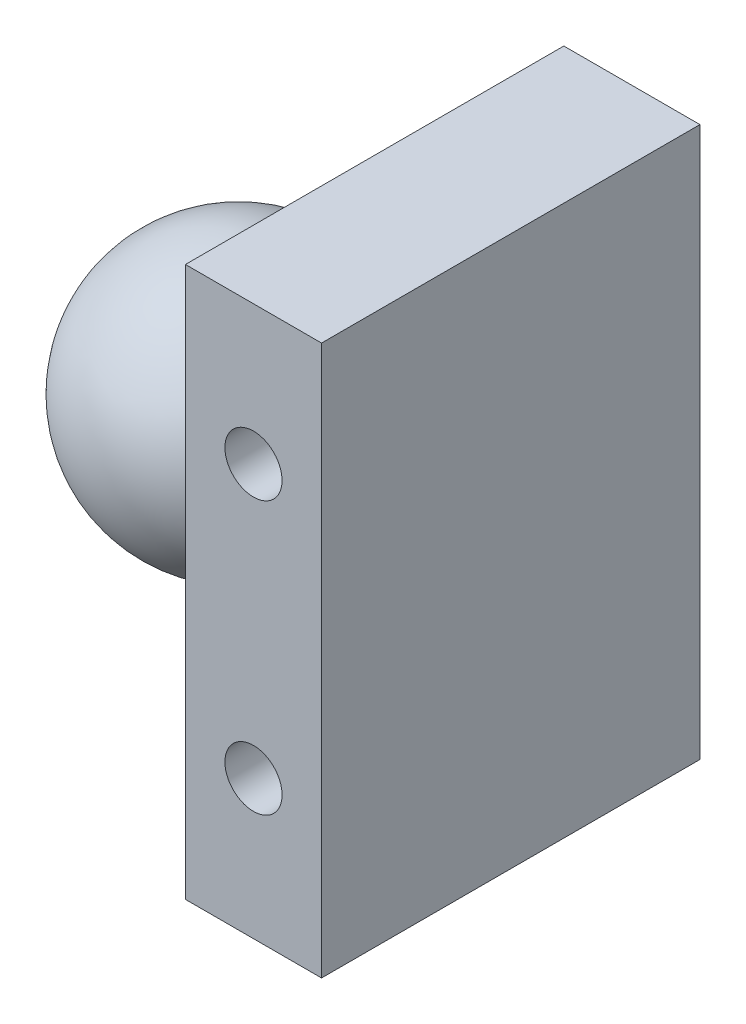
ISO-10303-21;
HEADER;
FILE_DESCRIPTION(('STEP AP214'),'2;1');
FILE_NAME('part.step','',(''),(''),'','','');
FILE_SCHEMA(('AUTOMOTIVE_DESIGN { 1 0 10303 214 1 1 1 1 }'));
ENDSEC;
DATA;
#1=APPLICATION_CONTEXT('core data for automotive mechanical design processes');
#2=APPLICATION_PROTOCOL_DEFINITION('international standard','automotive_design',2000,#1);
#3=PRODUCT_CONTEXT('',#1,'mechanical');
#4=PRODUCT('Part','Part','',(#3));
#5=PRODUCT_RELATED_PRODUCT_CATEGORY('part','',(#4));
#6=PRODUCT_DEFINITION_FORMATION('','',#4);
#7=PRODUCT_DEFINITION_CONTEXT('part definition',#1,'design');
#8=PRODUCT_DEFINITION('design','',#6,#7);
#9=PRODUCT_DEFINITION_SHAPE('','',#8);
#10=(LENGTH_UNIT() NAMED_UNIT(*) SI_UNIT(.MILLI.,.METRE.));
#11=(NAMED_UNIT(*) PLANE_ANGLE_UNIT() SI_UNIT($,.RADIAN.));
#12=(NAMED_UNIT(*) SI_UNIT($,.STERADIAN.) SOLID_ANGLE_UNIT());
#13=UNCERTAINTY_MEASURE_WITH_UNIT(LENGTH_MEASURE(1.E-05),#10,'distance_accuracy_value','');
#14=(GEOMETRIC_REPRESENTATION_CONTEXT(3) GLOBAL_UNCERTAINTY_ASSIGNED_CONTEXT((#13)) GLOBAL_UNIT_ASSIGNED_CONTEXT((#10,
#11,#12)) REPRESENTATION_CONTEXT('',''));
#15=CARTESIAN_POINT('',(0.,0.,0.));
#16=DIRECTION('',(0.,0.,1.));
#17=DIRECTION('',(1.,0.,0.));
#18=AXIS2_PLACEMENT_3D('',#15,#16,#17);
#19=CARTESIAN_POINT('',(2.5,10.1,13.9));
#20=DIRECTION('',(-1.,0.,0.));
#21=DIRECTION('',(0.,-1.,0.));
#22=AXIS2_PLACEMENT_3D('',#19,#20,#21);
#23=PLANE('',#22);
#24=DIRECTION('',(0.,1.,0.));
#25=VECTOR('',#24,1.);
#26=CARTESIAN_POINT('',(2.5,10.1,0.));
#27=LINE('',#26,#25);
#28=CARTESIAN_POINT('',(2.5,-10.1,0.));
#29=VERTEX_POINT('',#28);
#30=CARTESIAN_POINT('',(2.5,10.1,0.));
#31=VERTEX_POINT('',#30);
#32=EDGE_CURVE('E118',#29,#31,#27,.T.);
#33=ORIENTED_EDGE('',*,*,#32,.T.);
#34=DIRECTION('',(0.,0.,-1.));
#35=VECTOR('',#34,1.);
#36=CARTESIAN_POINT('',(2.5,10.1,13.9));
#37=LINE('',#36,#35);
#38=CARTESIAN_POINT('',(2.5,10.1,13.9));
#39=VERTEX_POINT('',#38);
#40=EDGE_CURVE('E55',#39,#31,#37,.T.);
#41=ORIENTED_EDGE('',*,*,#40,.F.);
#42=DIRECTION('',(0.,1.,0.));
#43=VECTOR('',#42,1.);
#44=CARTESIAN_POINT('',(2.5,10.1,13.9));
#45=LINE('',#44,#43);
#46=CARTESIAN_POINT('',(2.5,-10.1,13.9));
#47=VERTEX_POINT('',#46);
#48=EDGE_CURVE('E105',#47,#39,#45,.T.);
#49=ORIENTED_EDGE('',*,*,#48,.F.);
#50=DIRECTION('',(0.,0.,-1.));
#51=VECTOR('',#50,1.);
#52=CARTESIAN_POINT('',(2.5,-10.1,13.9));
#53=LINE('',#52,#51);
#54=EDGE_CURVE('E114',#47,#29,#53,.T.);
#55=ORIENTED_EDGE('',*,*,#54,.T.);
#56=EDGE_LOOP('',(#33,#41,#49,#55));
#57=FACE_BOUND('',#56,.T.);
#58=ADVANCED_FACE('F52',(#57),#23,.F.);
#59=CARTESIAN_POINT('',(-2.5,10.1,13.9));
#60=DIRECTION('',(0.,-1.,0.));
#61=DIRECTION('',(0.,0.,-1.));
#62=AXIS2_PLACEMENT_3D('',#59,#60,#61);
#63=PLANE('',#62);
#64=DIRECTION('',(-1.,0.,0.));
#65=VECTOR('',#64,1.);
#66=CARTESIAN_POINT('',(-2.5,10.1,0.));
#67=LINE('',#66,#65);
#68=CARTESIAN_POINT('',(-2.5,10.1,0.));
#69=VERTEX_POINT('',#68);
#70=EDGE_CURVE('E110',#31,#69,#67,.T.);
#71=ORIENTED_EDGE('',*,*,#70,.T.);
#72=DIRECTION('',(0.,0.,-1.));
#73=VECTOR('',#72,1.);
#74=CARTESIAN_POINT('',(-2.5,10.1,13.9));
#75=LINE('',#74,#73);
#76=CARTESIAN_POINT('',(-2.5,10.1,13.9));
#77=VERTEX_POINT('',#76);
#78=EDGE_CURVE('E108',#77,#69,#75,.T.);
#79=ORIENTED_EDGE('',*,*,#78,.F.);
#80=DIRECTION('',(-1.,0.,0.));
#81=VECTOR('',#80,1.);
#82=CARTESIAN_POINT('',(-2.5,10.1,13.9));
#83=LINE('',#82,#81);
#84=EDGE_CURVE('E100',#39,#77,#83,.T.);
#85=ORIENTED_EDGE('',*,*,#84,.F.);
#86=ORIENTED_EDGE('',*,*,#40,.T.);
#87=EDGE_LOOP('',(#71,#79,#85,#86));
#88=FACE_BOUND('',#87,.T.);
#89=ADVANCED_FACE('F109',(#88),#63,.F.);
#90=CARTESIAN_POINT('',(-2.5,10.1,13.9));
#91=DIRECTION('',(1.,0.,0.));
#92=DIRECTION('',(0.,1.,0.));
#93=AXIS2_PLACEMENT_3D('',#90,#91,#92);
#94=PLANE('',#93);
#95=CARTESIAN_POINT('',(-2.5,0.,6.95));
#96=DIRECTION('',(-1.,0.,0.));
#97=DIRECTION('',(0.,-1.,0.));
#98=AXIS2_PLACEMENT_3D('',#95,#96,#97);
#99=CIRCLE('',#98,3.);
#100=CARTESIAN_POINT('',(-2.5,-3.,6.95));
#101=VERTEX_POINT('',#100);
#102=EDGE_CURVE('E13',#101,#101,#99,.T.);
#103=ORIENTED_EDGE('',*,*,#102,.F.);
#104=EDGE_LOOP('',(#103));
#105=FACE_BOUND('',#104,.T.);
#106=DIRECTION('',(0.,-1.,0.));
#107=VECTOR('',#106,1.);
#108=CARTESIAN_POINT('',(-2.5,10.1,0.));
#109=LINE('',#108,#107);
#110=CARTESIAN_POINT('',(-2.5,-10.1,0.));
#111=VERTEX_POINT('',#110);
#112=EDGE_CURVE('E86',#69,#111,#109,.T.);
#113=ORIENTED_EDGE('',*,*,#112,.T.);
#114=DIRECTION('',(0.,0.,-1.));
#115=VECTOR('',#114,1.);
#116=CARTESIAN_POINT('',(-2.5,-10.1,13.9));
#117=LINE('',#116,#115);
#118=CARTESIAN_POINT('',(-2.5,-10.1,13.9));
#119=VERTEX_POINT('',#118);
#120=EDGE_CURVE('E111',#119,#111,#117,.T.);
#121=ORIENTED_EDGE('',*,*,#120,.F.);
#122=DIRECTION('',(0.,-1.,0.));
#123=VECTOR('',#122,1.);
#124=CARTESIAN_POINT('',(-2.5,10.1,13.9));
#125=LINE('',#124,#123);
#126=EDGE_CURVE('E103',#77,#119,#125,.T.);
#127=ORIENTED_EDGE('',*,*,#126,.F.);
#128=ORIENTED_EDGE('',*,*,#78,.T.);
#129=EDGE_LOOP('',(#113,#121,#127,#128));
#130=FACE_BOUND('',#129,.T.);
#131=ADVANCED_FACE('F112',(#105,#130),#94,.F.);
#132=CARTESIAN_POINT('',(-2.5,-10.1,13.9));
#133=DIRECTION('',(0.,1.,0.));
#134=DIRECTION('',(0.,0.,1.));
#135=AXIS2_PLACEMENT_3D('',#132,#133,#134);
#136=PLANE('',#135);
#137=DIRECTION('',(1.,0.,0.));
#138=VECTOR('',#137,1.);
#139=CARTESIAN_POINT('',(-2.5,-10.1,0.));
#140=LINE('',#139,#138);
#141=EDGE_CURVE('E92',#111,#29,#140,.T.);
#142=ORIENTED_EDGE('',*,*,#141,.T.);
#143=ORIENTED_EDGE('',*,*,#54,.F.);
#144=DIRECTION('',(1.,0.,0.));
#145=VECTOR('',#144,1.);
#146=CARTESIAN_POINT('',(-2.5,-10.1,13.9));
#147=LINE('',#146,#145);
#148=EDGE_CURVE('E69',#119,#47,#147,.T.);
#149=ORIENTED_EDGE('',*,*,#148,.F.);
#150=ORIENTED_EDGE('',*,*,#120,.T.);
#151=EDGE_LOOP('',(#142,#143,#149,#150));
#152=FACE_BOUND('',#151,.T.);
#153=ADVANCED_FACE('F126',(#152),#136,.F.);
#154=CARTESIAN_POINT('',(0.,0.,13.9));
#155=DIRECTION('',(0.,0.,1.));
#156=DIRECTION('',(1.,0.,0.));
#157=AXIS2_PLACEMENT_3D('',#154,#155,#156);
#158=PLANE('',#157);
#159=CARTESIAN_POINT('',(0.,5.,13.9));
#160=DIRECTION('',(0.,0.,-1.));
#161=DIRECTION('',(-1.,0.,0.));
#162=AXIS2_PLACEMENT_3D('',#159,#160,#161);
#163=CIRCLE('',#162,1.05);
#164=CARTESIAN_POINT('',(-1.05,5.,13.9));
#165=VERTEX_POINT('',#164);
#166=EDGE_CURVE('E121',#165,#165,#163,.T.);
#167=ORIENTED_EDGE('',*,*,#166,.T.);
#168=EDGE_LOOP('',(#167));
#169=FACE_BOUND('',#168,.T.);
#170=CARTESIAN_POINT('',(-1.03877078427306E-13,-5.,13.9));
#171=DIRECTION('',(0.,0.,-1.));
#172=DIRECTION('',(-1.,0.,0.));
#173=AXIS2_PLACEMENT_3D('',#170,#171,#172);
#174=CIRCLE('',#173,1.05);
#175=CARTESIAN_POINT('',(-1.0500000000001,-5.,13.9));
#176=VERTEX_POINT('',#175);
#177=EDGE_CURVE('E135',#176,#176,#174,.T.);
#178=ORIENTED_EDGE('',*,*,#177,.T.);
#179=EDGE_LOOP('',(#178));
#180=FACE_BOUND('',#179,.T.);
#181=ORIENTED_EDGE('',*,*,#48,.T.);
#182=ORIENTED_EDGE('',*,*,#84,.T.);
#183=ORIENTED_EDGE('',*,*,#126,.T.);
#184=ORIENTED_EDGE('',*,*,#148,.T.);
#185=EDGE_LOOP('',(#181,#182,#183,#184));
#186=FACE_BOUND('',#185,.T.);
#187=ADVANCED_FACE('F101',(#169,#180,#186),#158,.T.);
#188=CARTESIAN_POINT('',(0.,0.,0.));
#189=DIRECTION('',(0.,0.,1.));
#190=DIRECTION('',(1.,0.,0.));
#191=AXIS2_PLACEMENT_3D('',#188,#189,#190);
#192=PLANE('',#191);
#193=CARTESIAN_POINT('',(0.,5.,0.));
#194=DIRECTION('',(0.,0.,-1.));
#195=DIRECTION('',(-1.,0.,0.));
#196=AXIS2_PLACEMENT_3D('',#193,#194,#195);
#197=CIRCLE('',#196,1.05);
#198=CARTESIAN_POINT('',(-1.05,5.,0.));
#199=VERTEX_POINT('',#198);
#200=EDGE_CURVE('E139',#199,#199,#197,.T.);
#201=ORIENTED_EDGE('',*,*,#200,.F.);
#202=EDGE_LOOP('',(#201));
#203=FACE_BOUND('',#202,.T.);
#204=CARTESIAN_POINT('',(-1.03877078427306E-13,-5.,0.));
#205=DIRECTION('',(0.,0.,-1.));
#206=DIRECTION('',(-1.,0.,0.));
#207=AXIS2_PLACEMENT_3D('',#204,#205,#206);
#208=CIRCLE('',#207,1.05);
#209=CARTESIAN_POINT('',(-1.0500000000001,-5.,0.));
#210=VERTEX_POINT('',#209);
#211=EDGE_CURVE('E132',#210,#210,#208,.T.);
#212=ORIENTED_EDGE('',*,*,#211,.F.);
#213=EDGE_LOOP('',(#212));
#214=FACE_BOUND('',#213,.T.);
#215=ORIENTED_EDGE('',*,*,#32,.F.);
#216=ORIENTED_EDGE('',*,*,#141,.F.);
#217=ORIENTED_EDGE('',*,*,#112,.F.);
#218=ORIENTED_EDGE('',*,*,#70,.F.);
#219=EDGE_LOOP('',(#215,#216,#217,#218));
#220=FACE_BOUND('',#219,.T.);
#221=ADVANCED_FACE('F129',(#203,#214,#220),#192,.F.);
#222=CARTESIAN_POINT('',(-1.03877078427306E-13,-5.,13.9));
#223=DIRECTION('',(0.,0.,-1.));
#224=DIRECTION('',(-1.,0.,0.));
#225=AXIS2_PLACEMENT_3D('',#222,#223,#224);
#226=CYLINDRICAL_SURFACE('',#225,1.05);
#227=ORIENTED_EDGE('',*,*,#177,.F.);
#228=EDGE_LOOP('',(#227));
#229=FACE_BOUND('',#228,.T.);
#230=ORIENTED_EDGE('',*,*,#211,.T.);
#231=EDGE_LOOP('',(#230));
#232=FACE_BOUND('',#231,.T.);
#233=ADVANCED_FACE('F201',(#229,#232),#226,.F.);
#234=CARTESIAN_POINT('',(0.,5.,13.9));
#235=DIRECTION('',(0.,0.,-1.));
#236=DIRECTION('',(-1.,0.,0.));
#237=AXIS2_PLACEMENT_3D('',#234,#235,#236);
#238=CYLINDRICAL_SURFACE('',#237,1.05);
#239=ORIENTED_EDGE('',*,*,#166,.F.);
#240=EDGE_LOOP('',(#239));
#241=FACE_BOUND('',#240,.T.);
#242=ORIENTED_EDGE('',*,*,#200,.T.);
#243=EDGE_LOOP('',(#242));
#244=FACE_BOUND('',#243,.T.);
#245=ADVANCED_FACE('F152',(#241,#244),#238,.F.);
#246=CARTESIAN_POINT('',(-3.5,0.,6.95));
#247=DIRECTION('',(1.,0.,0.));
#248=DIRECTION('',(0.,1.,0.));
#249=AXIS2_PLACEMENT_3D('',#246,#247,#248);
#250=CYLINDRICAL_SURFACE('',#249,3.);
#251=CARTESIAN_POINT('',(-3.5,0.,6.95));
#252=DIRECTION('',(-1.,0.,0.));
#253=DIRECTION('',(0.,-1.,0.));
#254=AXIS2_PLACEMENT_3D('',#251,#252,#253);
#255=CIRCLE('',#254,3.);
#256=CARTESIAN_POINT('',(-3.5,-3.,6.95));
#257=VERTEX_POINT('',#256);
#258=EDGE_CURVE('E136',#257,#257,#255,.T.);
#259=ORIENTED_EDGE('',*,*,#258,.F.);
#260=EDGE_LOOP('',(#259));
#261=FACE_BOUND('',#260,.T.);
#262=ORIENTED_EDGE('',*,*,#102,.T.);
#263=EDGE_LOOP('',(#262));
#264=FACE_BOUND('',#263,.T.);
#265=ADVANCED_FACE('F149',(#261,#264),#250,.T.);
#266=CARTESIAN_POINT('',(-7.5,0.,6.95));
#267=DIRECTION('',(1.,0.,0.));
#268=DIRECTION('',(0.,0.,1.));
#269=AXIS2_PLACEMENT_3D('',#266,#267,#268);
#270=SPHERICAL_SURFACE('',#269,5.);
#271=ORIENTED_EDGE('',*,*,#258,.T.);
#272=EDGE_LOOP('',(#271));
#273=FACE_BOUND('',#272,.T.);
#274=ADVANCED_FACE('F147',(#273),#270,.T.);
#275=CLOSED_SHELL('',(#58,#89,#131,#153,#187,#221,#233,#245,#265,#274));
#276=MANIFOLD_SOLID_BREP('B2',#275);
#277=ADVANCED_BREP_SHAPE_REPRESENTATION('',(#18,#276),#14);
#278=SHAPE_DEFINITION_REPRESENTATION(#9,#277);
ENDSEC;
END-ISO-10303-21;
